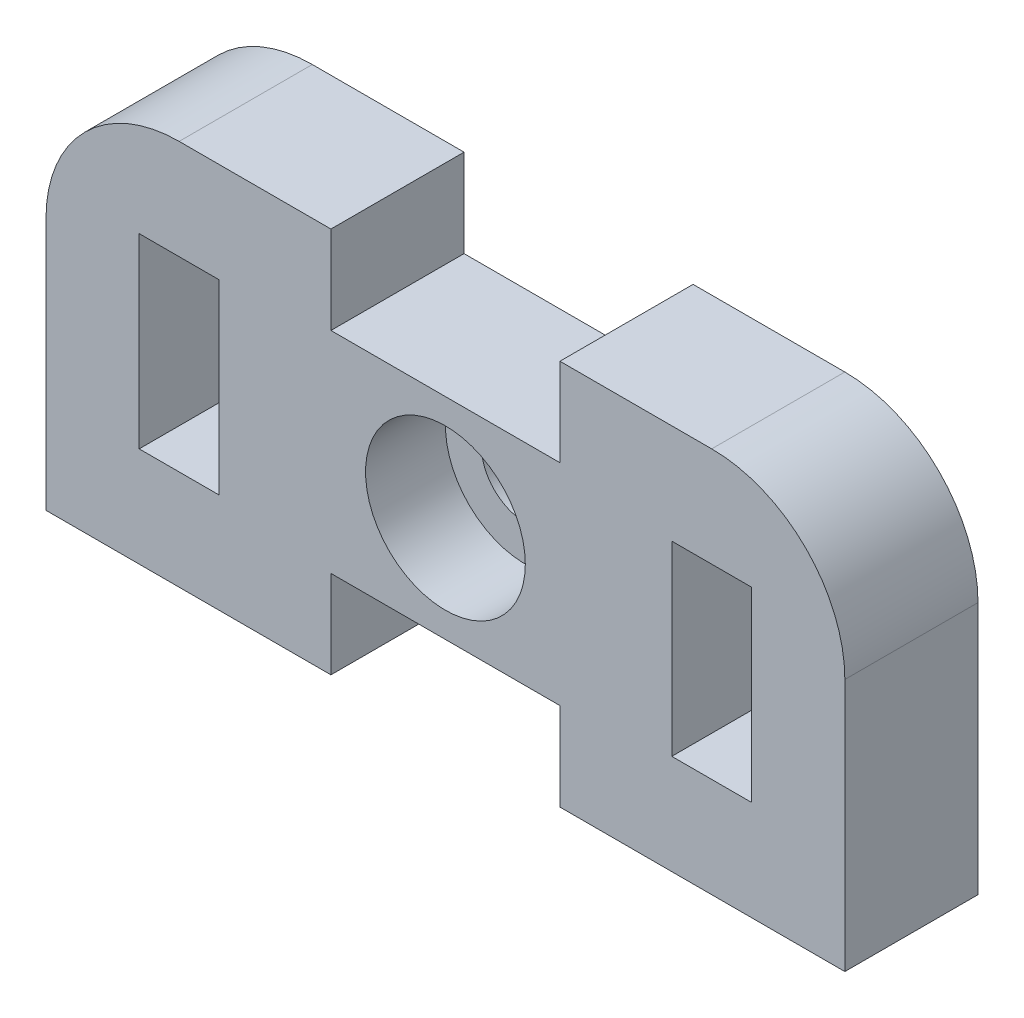
ISO-10303-21;
HEADER;
FILE_DESCRIPTION(('STEP AP214'),'2;1');
FILE_NAME('part.step','',(''),(''),'','','');
FILE_SCHEMA(('AUTOMOTIVE_DESIGN { 1 0 10303 214 1 1 1 1 }'));
ENDSEC;
DATA;
#1=APPLICATION_CONTEXT('core data for automotive mechanical design processes');
#2=APPLICATION_PROTOCOL_DEFINITION('international standard','automotive_design',2000,#1);
#3=PRODUCT_CONTEXT('',#1,'mechanical');
#4=PRODUCT('Part','Part','',(#3));
#5=PRODUCT_RELATED_PRODUCT_CATEGORY('part','',(#4));
#6=PRODUCT_DEFINITION_FORMATION('','',#4);
#7=PRODUCT_DEFINITION_CONTEXT('part definition',#1,'design');
#8=PRODUCT_DEFINITION('design','',#6,#7);
#9=PRODUCT_DEFINITION_SHAPE('','',#8);
#10=(LENGTH_UNIT() NAMED_UNIT(*) SI_UNIT(.MILLI.,.METRE.));
#11=(NAMED_UNIT(*) PLANE_ANGLE_UNIT() SI_UNIT($,.RADIAN.));
#12=(NAMED_UNIT(*) SI_UNIT($,.STERADIAN.) SOLID_ANGLE_UNIT());
#13=UNCERTAINTY_MEASURE_WITH_UNIT(LENGTH_MEASURE(1.E-05),#10,'distance_accuracy_value','');
#14=(GEOMETRIC_REPRESENTATION_CONTEXT(3) GLOBAL_UNCERTAINTY_ASSIGNED_CONTEXT((#13)) GLOBAL_UNIT_ASSIGNED_CONTEXT((#10,
#11,#12)) REPRESENTATION_CONTEXT('',''));
#15=CARTESIAN_POINT('',(0.,0.,0.));
#16=DIRECTION('',(0.,0.,1.));
#17=DIRECTION('',(1.,0.,0.));
#18=AXIS2_PLACEMENT_3D('',#15,#16,#17);
#19=CARTESIAN_POINT('',(-1.43060106815256E-13,57.75,244.));
#20=DIRECTION('',(0.,0.,-1.));
#21=DIRECTION('',(-1.,0.,0.));
#22=AXIS2_PLACEMENT_3D('',#19,#20,#21);
#23=CYLINDRICAL_SURFACE('',#22,1.65);
#24=CARTESIAN_POINT('',(-1.41835460016109E-13,57.75,239.));
#25=DIRECTION('',(0.,0.,1.));
#26=DIRECTION('',(1.,0.,0.));
#27=AXIS2_PLACEMENT_3D('',#24,#25,#26);
#28=CIRCLE('',#27,1.65);
#29=CARTESIAN_POINT('',(1.64999999999986,57.75,239.));
#30=VERTEX_POINT('',#29);
#31=EDGE_CURVE('E306',#30,#30,#28,.T.);
#32=ORIENTED_EDGE('',*,*,#31,.F.);
#33=EDGE_LOOP('',(#32));
#34=FACE_BOUND('',#33,.T.);
#35=CARTESIAN_POINT('',(-1.42325318735768E-13,57.75,241.));
#36=DIRECTION('',(0.,0.,1.));
#37=DIRECTION('',(1.,0.,0.));
#38=AXIS2_PLACEMENT_3D('',#35,#36,#37);
#39=CIRCLE('',#38,1.65);
#40=CARTESIAN_POINT('',(1.64999999999986,57.75,241.));
#41=VERTEX_POINT('',#40);
#42=EDGE_CURVE('E611',#41,#41,#39,.T.);
#43=ORIENTED_EDGE('',*,*,#42,.T.);
#44=EDGE_LOOP('',(#43));
#45=FACE_BOUND('',#44,.T.);
#46=ADVANCED_FACE('F16',(#34,#45),#23,.F.);
#47=CARTESIAN_POINT('',(8.49999999999986,58.0388661026955,244.));
#48=DIRECTION('',(-1.,0.,0.));
#49=DIRECTION('',(0.,0.,1.));
#50=AXIS2_PLACEMENT_3D('',#47,#48,#49);
#51=PLANE('',#50);
#52=DIRECTION('',(0.,1.,0.));
#53=VECTOR('',#52,1.);
#54=CARTESIAN_POINT('',(8.49999999999986,58.0388661026955,239.));
#55=LINE('',#54,#53);
#56=CARTESIAN_POINT('',(8.49999999999986,54.25,239.));
#57=VERTEX_POINT('',#56);
#58=CARTESIAN_POINT('',(8.49999999999986,61.25,239.));
#59=VERTEX_POINT('',#58);
#60=EDGE_CURVE('E361',#57,#59,#55,.T.);
#61=ORIENTED_EDGE('',*,*,#60,.T.);
#62=DIRECTION('',(0.,0.,-1.));
#63=VECTOR('',#62,1.);
#64=CARTESIAN_POINT('',(8.49999999999986,61.25,244.));
#65=LINE('',#64,#63);
#66=CARTESIAN_POINT('',(8.49999999999986,61.25,244.));
#67=VERTEX_POINT('',#66);
#68=EDGE_CURVE('E386',#67,#59,#65,.T.);
#69=ORIENTED_EDGE('',*,*,#68,.F.);
#70=DIRECTION('',(0.,1.,0.));
#71=VECTOR('',#70,1.);
#72=CARTESIAN_POINT('',(8.49999999999986,58.0388661026955,244.));
#73=LINE('',#72,#71);
#74=CARTESIAN_POINT('',(8.49999999999986,54.25,244.));
#75=VERTEX_POINT('',#74);
#76=EDGE_CURVE('E290',#75,#67,#73,.T.);
#77=ORIENTED_EDGE('',*,*,#76,.F.);
#78=DIRECTION('',(0.,0.,-1.));
#79=VECTOR('',#78,1.);
#80=CARTESIAN_POINT('',(8.49999999999986,54.25,244.));
#81=LINE('',#80,#79);
#82=EDGE_CURVE('E376',#75,#57,#81,.T.);
#83=ORIENTED_EDGE('',*,*,#82,.T.);
#84=EDGE_LOOP('',(#61,#69,#77,#83));
#85=FACE_BOUND('',#84,.T.);
#86=ADVANCED_FACE('F553',(#85),#51,.F.);
#87=CARTESIAN_POINT('',(10.4893748685716,61.25,244.));
#88=DIRECTION('',(0.,1.,0.));
#89=DIRECTION('',(0.,0.,1.));
#90=AXIS2_PLACEMENT_3D('',#87,#88,#89);
#91=PLANE('',#90);
#92=DIRECTION('',(1.,0.,0.));
#93=VECTOR('',#92,1.);
#94=CARTESIAN_POINT('',(10.4893748685716,61.25,239.));
#95=LINE('',#94,#93);
#96=CARTESIAN_POINT('',(11.4999999999999,61.25,239.));
#97=VERTEX_POINT('',#96);
#98=EDGE_CURVE('E365',#59,#97,#95,.T.);
#99=ORIENTED_EDGE('',*,*,#98,.T.);
#100=DIRECTION('',(0.,0.,-1.));
#101=VECTOR('',#100,1.);
#102=CARTESIAN_POINT('',(11.4999999999999,61.25,244.));
#103=LINE('',#102,#101);
#104=CARTESIAN_POINT('',(11.4999999999999,61.25,244.));
#105=VERTEX_POINT('',#104);
#106=EDGE_CURVE('E383',#105,#97,#103,.T.);
#107=ORIENTED_EDGE('',*,*,#106,.F.);
#108=DIRECTION('',(1.,0.,0.));
#109=VECTOR('',#108,1.);
#110=CARTESIAN_POINT('',(10.4893748685716,61.25,244.));
#111=LINE('',#110,#109);
#112=EDGE_CURVE('E294',#67,#105,#111,.T.);
#113=ORIENTED_EDGE('',*,*,#112,.F.);
#114=ORIENTED_EDGE('',*,*,#68,.T.);
#115=EDGE_LOOP('',(#99,#107,#113,#114));
#116=FACE_BOUND('',#115,.T.);
#117=ADVANCED_FACE('F548',(#116),#91,.F.);
#118=CARTESIAN_POINT('',(11.4999999999999,58.0388661026955,244.));
#119=DIRECTION('',(-1.,0.,0.));
#120=DIRECTION('',(0.,0.,1.));
#121=AXIS2_PLACEMENT_3D('',#118,#119,#120);
#122=PLANE('',#121);
#123=DIRECTION('',(0.,1.,0.));
#124=VECTOR('',#123,1.);
#125=CARTESIAN_POINT('',(11.4999999999999,58.0388661026955,239.));
#126=LINE('',#125,#124);
#127=CARTESIAN_POINT('',(11.4999999999999,54.25,239.));
#128=VERTEX_POINT('',#127);
#129=EDGE_CURVE('E369',#128,#97,#126,.T.);
#130=ORIENTED_EDGE('',*,*,#129,.F.);
#131=DIRECTION('',(0.,0.,-1.));
#132=VECTOR('',#131,1.);
#133=CARTESIAN_POINT('',(11.4999999999999,54.25,244.));
#134=LINE('',#133,#132);
#135=CARTESIAN_POINT('',(11.4999999999999,54.25,244.));
#136=VERTEX_POINT('',#135);
#137=EDGE_CURVE('E379',#136,#128,#134,.T.);
#138=ORIENTED_EDGE('',*,*,#137,.F.);
#139=DIRECTION('',(0.,1.,0.));
#140=VECTOR('',#139,1.);
#141=CARTESIAN_POINT('',(11.4999999999999,58.0388661026955,244.));
#142=LINE('',#141,#140);
#143=EDGE_CURVE('E297',#136,#105,#142,.T.);
#144=ORIENTED_EDGE('',*,*,#143,.T.);
#145=ORIENTED_EDGE('',*,*,#106,.T.);
#146=EDGE_LOOP('',(#130,#138,#144,#145));
#147=FACE_BOUND('',#146,.T.);
#148=ADVANCED_FACE('F552',(#147),#122,.T.);
#149=CARTESIAN_POINT('',(0.,50.5,244.));
#150=DIRECTION('',(0.,-1.,0.));
#151=DIRECTION('',(0.,0.,-1.));
#152=AXIS2_PLACEMENT_3D('',#149,#150,#151);
#153=PLANE('',#152);
#154=DIRECTION('',(-1.,0.,0.));
#155=VECTOR('',#154,1.);
#156=CARTESIAN_POINT('',(0.,50.5,239.));
#157=LINE('',#156,#155);
#158=CARTESIAN_POINT('',(-4.30000000000014,50.5,239.));
#159=VERTEX_POINT('',#158);
#160=CARTESIAN_POINT('',(-15.,50.5,239.));
#161=VERTEX_POINT('',#160);
#162=EDGE_CURVE('E322',#159,#161,#157,.T.);
#163=ORIENTED_EDGE('',*,*,#162,.F.);
#164=DIRECTION('',(0.,0.,-1.));
#165=VECTOR('',#164,1.);
#166=CARTESIAN_POINT('',(-4.30000000000014,50.5,244.));
#167=LINE('',#166,#165);
#168=CARTESIAN_POINT('',(-4.30000000000014,50.5,244.));
#169=VERTEX_POINT('',#168);
#170=EDGE_CURVE('E380',#169,#159,#167,.T.);
#171=ORIENTED_EDGE('',*,*,#170,.F.);
#172=DIRECTION('',(-1.,0.,0.));
#173=VECTOR('',#172,1.);
#174=CARTESIAN_POINT('',(0.,50.5,244.));
#175=LINE('',#174,#173);
#176=CARTESIAN_POINT('',(-15.,50.5,244.));
#177=VERTEX_POINT('',#176);
#178=EDGE_CURVE('E253',#169,#177,#175,.T.);
#179=ORIENTED_EDGE('',*,*,#178,.T.);
#180=DIRECTION('',(0.,0.,-1.));
#181=VECTOR('',#180,1.);
#182=CARTESIAN_POINT('',(-15.,50.5,244.));
#183=LINE('',#182,#181);
#184=EDGE_CURVE('E226',#177,#161,#183,.T.);
#185=ORIENTED_EDGE('',*,*,#184,.T.);
#186=EDGE_LOOP('',(#163,#171,#179,#185));
#187=FACE_BOUND('',#186,.T.);
#188=ADVANCED_FACE('F463',(#187),#153,.T.);
#189=CARTESIAN_POINT('',(-4.30000000000014,53.0788219124079,244.));
#190=DIRECTION('',(-1.,0.,0.));
#191=DIRECTION('',(0.,0.,1.));
#192=AXIS2_PLACEMENT_3D('',#189,#190,#191);
#193=PLANE('',#192);
#194=DIRECTION('',(0.,1.,0.));
#195=VECTOR('',#194,1.);
#196=CARTESIAN_POINT('',(-4.30000000000014,53.0788219124079,239.));
#197=LINE('',#196,#195);
#198=CARTESIAN_POINT('',(-4.30000000000014,53.8,239.));
#199=VERTEX_POINT('',#198);
#200=EDGE_CURVE('E326',#159,#199,#197,.T.);
#201=ORIENTED_EDGE('',*,*,#200,.T.);
#202=DIRECTION('',(0.,0.,-1.));
#203=VECTOR('',#202,1.);
#204=CARTESIAN_POINT('',(-4.30000000000014,53.8,244.));
#205=LINE('',#204,#203);
#206=CARTESIAN_POINT('',(-4.30000000000014,53.8,244.));
#207=VERTEX_POINT('',#206);
#208=EDGE_CURVE('E418',#207,#199,#205,.T.);
#209=ORIENTED_EDGE('',*,*,#208,.F.);
#210=DIRECTION('',(0.,1.,0.));
#211=VECTOR('',#210,1.);
#212=CARTESIAN_POINT('',(-4.30000000000014,53.0788219124079,244.));
#213=LINE('',#212,#211);
#214=EDGE_CURVE('E257',#169,#207,#213,.T.);
#215=ORIENTED_EDGE('',*,*,#214,.F.);
#216=ORIENTED_EDGE('',*,*,#170,.T.);
#217=EDGE_LOOP('',(#201,#209,#215,#216));
#218=FACE_BOUND('',#217,.T.);
#219=ADVANCED_FACE('F472',(#218),#193,.F.);
#220=CARTESIAN_POINT('',(-0.0293236225844026,53.8,244.));
#221=DIRECTION('',(0.,-1.,0.));
#222=DIRECTION('',(1.,0.,0.));
#223=AXIS2_PLACEMENT_3D('',#220,#221,#222);
#224=PLANE('',#223);
#225=DIRECTION('',(-1.,0.,0.));
#226=VECTOR('',#225,1.);
#227=CARTESIAN_POINT('',(-0.0293236225844014,53.8,239.));
#228=LINE('',#227,#226);
#229=CARTESIAN_POINT('',(4.29999999999986,53.8,239.));
#230=VERTEX_POINT('',#229);
#231=EDGE_CURVE('E331',#230,#199,#228,.T.);
#232=ORIENTED_EDGE('',*,*,#231,.F.);
#233=DIRECTION('',(0.,0.,-1.));
#234=VECTOR('',#233,1.);
#235=CARTESIAN_POINT('',(4.29999999999986,53.8,244.));
#236=LINE('',#235,#234);
#237=CARTESIAN_POINT('',(4.29999999999986,53.8,244.));
#238=VERTEX_POINT('',#237);
#239=EDGE_CURVE('E415',#238,#230,#236,.T.);
#240=ORIENTED_EDGE('',*,*,#239,.F.);
#241=DIRECTION('',(-1.,0.,0.));
#242=VECTOR('',#241,1.);
#243=CARTESIAN_POINT('',(-0.0293236225844026,53.8,244.));
#244=LINE('',#243,#242);
#245=EDGE_CURVE('E261',#238,#207,#244,.T.);
#246=ORIENTED_EDGE('',*,*,#245,.T.);
#247=ORIENTED_EDGE('',*,*,#208,.T.);
#248=EDGE_LOOP('',(#232,#240,#246,#247));
#249=FACE_BOUND('',#248,.T.);
#250=ADVANCED_FACE('F475',(#249),#224,.T.);
#251=CARTESIAN_POINT('',(4.29999999999986,53.0788219124079,244.));
#252=DIRECTION('',(-1.,0.,0.));
#253=DIRECTION('',(0.,0.,1.));
#254=AXIS2_PLACEMENT_3D('',#251,#252,#253);
#255=PLANE('',#254);
#256=DIRECTION('',(0.,1.,0.));
#257=VECTOR('',#256,1.);
#258=CARTESIAN_POINT('',(4.29999999999986,53.0788219124079,239.));
#259=LINE('',#258,#257);
#260=CARTESIAN_POINT('',(4.29999999999986,50.5,239.));
#261=VERTEX_POINT('',#260);
#262=EDGE_CURVE('E335',#261,#230,#259,.T.);
#263=ORIENTED_EDGE('',*,*,#262,.F.);
#264=DIRECTION('',(0.,0.,-1.));
#265=VECTOR('',#264,1.);
#266=CARTESIAN_POINT('',(4.29999999999986,50.5,244.));
#267=LINE('',#266,#265);
#268=CARTESIAN_POINT('',(4.29999999999986,50.5,244.));
#269=VERTEX_POINT('',#268);
#270=EDGE_CURVE('E412',#269,#261,#267,.T.);
#271=ORIENTED_EDGE('',*,*,#270,.F.);
#272=DIRECTION('',(0.,1.,0.));
#273=VECTOR('',#272,1.);
#274=CARTESIAN_POINT('',(4.29999999999986,53.0788219124079,244.));
#275=LINE('',#274,#273);
#276=EDGE_CURVE('E265',#269,#238,#275,.T.);
#277=ORIENTED_EDGE('',*,*,#276,.T.);
#278=ORIENTED_EDGE('',*,*,#239,.T.);
#279=EDGE_LOOP('',(#263,#271,#277,#278));
#280=FACE_BOUND('',#279,.T.);
#281=ADVANCED_FACE('F478',(#280),#255,.T.);
#282=CARTESIAN_POINT('',(15.,50.5,239.));
#283=VERTEX_POINT('',#282);
#284=EDGE_CURVE('E327',#283,#261,#157,.T.);
#285=ORIENTED_EDGE('',*,*,#284,.F.);
#286=DIRECTION('',(0.,0.,-1.));
#287=VECTOR('',#286,1.);
#288=CARTESIAN_POINT('',(15.,50.5,244.));
#289=LINE('',#288,#287);
#290=CARTESIAN_POINT('',(15.,50.5,244.));
#291=VERTEX_POINT('',#290);
#292=EDGE_CURVE('E408',#291,#283,#289,.T.);
#293=ORIENTED_EDGE('',*,*,#292,.F.);
#294=EDGE_CURVE('E258',#291,#269,#175,.T.);
#295=ORIENTED_EDGE('',*,*,#294,.T.);
#296=ORIENTED_EDGE('',*,*,#270,.T.);
#297=EDGE_LOOP('',(#285,#293,#295,#296));
#298=FACE_BOUND('',#297,.T.);
#299=ADVANCED_FACE('F485',(#298),#153,.T.);
#300=CARTESIAN_POINT('',(15.,65.,244.));
#301=DIRECTION('',(1.,0.,0.));
#302=DIRECTION('',(0.,0.,-1.));
#303=AXIS2_PLACEMENT_3D('',#300,#301,#302);
#304=PLANE('',#303);
#305=DIRECTION('',(0.,-1.,0.));
#306=VECTOR('',#305,1.);
#307=CARTESIAN_POINT('',(15.,65.,239.));
#308=LINE('',#307,#306);
#309=CARTESIAN_POINT('',(15.,60.,239.));
#310=VERTEX_POINT('',#309);
#311=EDGE_CURVE('E339',#310,#283,#308,.T.);
#312=ORIENTED_EDGE('',*,*,#311,.F.);
#313=DIRECTION('',(0.,0.,-1.));
#314=VECTOR('',#313,1.);
#315=CARTESIAN_POINT('',(15.,60.,244.));
#316=LINE('',#315,#314);
#317=CARTESIAN_POINT('',(15.,60.,244.));
#318=VERTEX_POINT('',#317);
#319=EDGE_CURVE('E439',#310,#318,#316,.F.);
#320=ORIENTED_EDGE('',*,*,#319,.T.);
#321=DIRECTION('',(0.,-1.,0.));
#322=VECTOR('',#321,1.);
#323=CARTESIAN_POINT('',(15.,65.,244.));
#324=LINE('',#323,#322);
#325=EDGE_CURVE('E269',#318,#291,#324,.T.);
#326=ORIENTED_EDGE('',*,*,#325,.T.);
#327=ORIENTED_EDGE('',*,*,#292,.T.);
#328=EDGE_LOOP('',(#312,#320,#326,#327));
#329=FACE_BOUND('',#328,.T.);
#330=ADVANCED_FACE('F595',(#329),#304,.T.);
#331=CARTESIAN_POINT('',(0.,65.,244.));
#332=DIRECTION('',(0.,-1.,0.));
#333=DIRECTION('',(0.,0.,-1.));
#334=AXIS2_PLACEMENT_3D('',#331,#332,#333);
#335=PLANE('',#334);
#336=DIRECTION('',(-1.,0.,0.));
#337=VECTOR('',#336,1.);
#338=CARTESIAN_POINT('',(0.,65.,244.));
#339=LINE('',#338,#337);
#340=CARTESIAN_POINT('',(10.,65.,244.));
#341=VERTEX_POINT('',#340);
#342=CARTESIAN_POINT('',(4.29999999999986,65.,244.));
#343=VERTEX_POINT('',#342);
#344=EDGE_CURVE('E272',#341,#343,#339,.T.);
#345=ORIENTED_EDGE('',*,*,#344,.F.);
#346=DIRECTION('',(0.,0.,-1.));
#347=VECTOR('',#346,1.);
#348=CARTESIAN_POINT('',(10.,65.,239.));
#349=LINE('',#348,#347);
#350=CARTESIAN_POINT('',(10.,65.,239.));
#351=VERTEX_POINT('',#350);
#352=EDGE_CURVE('E390',#341,#351,#349,.T.);
#353=ORIENTED_EDGE('',*,*,#352,.T.);
#354=DIRECTION('',(-1.,0.,0.));
#355=VECTOR('',#354,1.);
#356=CARTESIAN_POINT('',(0.,65.,239.));
#357=LINE('',#356,#355);
#358=CARTESIAN_POINT('',(4.29999999999986,65.,239.));
#359=VERTEX_POINT('',#358);
#360=EDGE_CURVE('E342',#351,#359,#357,.T.);
#361=ORIENTED_EDGE('',*,*,#360,.T.);
#362=DIRECTION('',(0.,0.,-1.));
#363=VECTOR('',#362,1.);
#364=CARTESIAN_POINT('',(4.29999999999986,65.,244.));
#365=LINE('',#364,#363);
#366=EDGE_CURVE('E404',#343,#359,#365,.T.);
#367=ORIENTED_EDGE('',*,*,#366,.F.);
#368=EDGE_LOOP('',(#345,#353,#361,#367));
#369=FACE_BOUND('',#368,.T.);
#370=ADVANCED_FACE('F509',(#369),#335,.F.);
#371=CARTESIAN_POINT('',(4.29999999999986,63.046423715353,244.));
#372=DIRECTION('',(1.,0.,0.));
#373=DIRECTION('',(0.,1.,0.));
#374=AXIS2_PLACEMENT_3D('',#371,#372,#373);
#375=PLANE('',#374);
#376=DIRECTION('',(0.,-1.,0.));
#377=VECTOR('',#376,1.);
#378=CARTESIAN_POINT('',(4.29999999999986,63.046423715353,239.));
#379=LINE('',#378,#377);
#380=CARTESIAN_POINT('',(4.29999999999986,61.7,239.));
#381=VERTEX_POINT('',#380);
#382=EDGE_CURVE('E345',#359,#381,#379,.T.);
#383=ORIENTED_EDGE('',*,*,#382,.T.);
#384=DIRECTION('',(0.,0.,-1.));
#385=VECTOR('',#384,1.);
#386=CARTESIAN_POINT('',(4.29999999999986,61.7,244.));
#387=LINE('',#386,#385);
#388=CARTESIAN_POINT('',(4.29999999999986,61.7,244.));
#389=VERTEX_POINT('',#388);
#390=EDGE_CURVE('E400',#389,#381,#387,.T.);
#391=ORIENTED_EDGE('',*,*,#390,.F.);
#392=DIRECTION('',(0.,-1.,0.));
#393=VECTOR('',#392,1.);
#394=CARTESIAN_POINT('',(4.29999999999986,63.046423715353,244.));
#395=LINE('',#394,#393);
#396=EDGE_CURVE('E275',#343,#389,#395,.T.);
#397=ORIENTED_EDGE('',*,*,#396,.F.);
#398=ORIENTED_EDGE('',*,*,#366,.T.);
#399=EDGE_LOOP('',(#383,#391,#397,#398));
#400=FACE_BOUND('',#399,.T.);
#401=ADVANCED_FACE('F500',(#400),#375,.F.);
#402=CARTESIAN_POINT('',(-0.00538397580391191,61.7,244.));
#403=DIRECTION('',(0.,-1.,0.));
#404=DIRECTION('',(1.,0.,0.));
#405=AXIS2_PLACEMENT_3D('',#402,#403,#404);
#406=PLANE('',#405);
#407=DIRECTION('',(-1.,0.,0.));
#408=VECTOR('',#407,1.);
#409=CARTESIAN_POINT('',(-0.00538397580391069,61.7,239.));
#410=LINE('',#409,#408);
#411=CARTESIAN_POINT('',(-4.30000000000014,61.7,239.));
#412=VERTEX_POINT('',#411);
#413=EDGE_CURVE('E350',#381,#412,#410,.T.);
#414=ORIENTED_EDGE('',*,*,#413,.T.);
#415=DIRECTION('',(0.,0.,-1.));
#416=VECTOR('',#415,1.);
#417=CARTESIAN_POINT('',(-4.30000000000014,61.7,244.));
#418=LINE('',#417,#416);
#419=CARTESIAN_POINT('',(-4.30000000000014,61.7,244.));
#420=VERTEX_POINT('',#419);
#421=EDGE_CURVE('E397',#420,#412,#418,.T.);
#422=ORIENTED_EDGE('',*,*,#421,.F.);
#423=DIRECTION('',(-1.,0.,0.));
#424=VECTOR('',#423,1.);
#425=CARTESIAN_POINT('',(-0.00538397580391191,61.7,244.));
#426=LINE('',#425,#424);
#427=EDGE_CURVE('E280',#389,#420,#426,.T.);
#428=ORIENTED_EDGE('',*,*,#427,.F.);
#429=ORIENTED_EDGE('',*,*,#390,.T.);
#430=EDGE_LOOP('',(#414,#422,#428,#429));
#431=FACE_BOUND('',#430,.T.);
#432=ADVANCED_FACE('F495',(#431),#406,.F.);
#433=CARTESIAN_POINT('',(-4.30000000000014,63.0464237153531,244.));
#434=DIRECTION('',(1.,0.,0.));
#435=DIRECTION('',(0.,1.,0.));
#436=AXIS2_PLACEMENT_3D('',#433,#434,#435);
#437=PLANE('',#436);
#438=DIRECTION('',(0.,-1.,0.));
#439=VECTOR('',#438,1.);
#440=CARTESIAN_POINT('',(-4.30000000000014,63.0464237153531,239.));
#441=LINE('',#440,#439);
#442=CARTESIAN_POINT('',(-4.30000000000014,65.,239.));
#443=VERTEX_POINT('',#442);
#444=EDGE_CURVE('E354',#443,#412,#441,.T.);
#445=ORIENTED_EDGE('',*,*,#444,.F.);
#446=DIRECTION('',(0.,0.,-1.));
#447=VECTOR('',#446,1.);
#448=CARTESIAN_POINT('',(-4.30000000000014,65.,244.));
#449=LINE('',#448,#447);
#450=CARTESIAN_POINT('',(-4.30000000000014,65.,244.));
#451=VERTEX_POINT('',#450);
#452=EDGE_CURVE('E394',#451,#443,#449,.T.);
#453=ORIENTED_EDGE('',*,*,#452,.F.);
#454=DIRECTION('',(0.,-1.,0.));
#455=VECTOR('',#454,1.);
#456=CARTESIAN_POINT('',(-4.30000000000014,63.0464237153531,244.));
#457=LINE('',#456,#455);
#458=EDGE_CURVE('E283',#451,#420,#457,.T.);
#459=ORIENTED_EDGE('',*,*,#458,.T.);
#460=ORIENTED_EDGE('',*,*,#421,.T.);
#461=EDGE_LOOP('',(#445,#453,#459,#460));
#462=FACE_BOUND('',#461,.T.);
#463=ADVANCED_FACE('F499',(#462),#437,.T.);
#464=CARTESIAN_POINT('',(-10.,65.,239.));
#465=VERTEX_POINT('',#464);
#466=EDGE_CURVE('E346',#443,#465,#357,.T.);
#467=ORIENTED_EDGE('',*,*,#466,.T.);
#468=DIRECTION('',(0.,0.,-1.));
#469=VECTOR('',#468,1.);
#470=CARTESIAN_POINT('',(-10.,65.,244.));
#471=LINE('',#470,#469);
#472=CARTESIAN_POINT('',(-10.,65.,244.));
#473=VERTEX_POINT('',#472);
#474=EDGE_CURVE('E10',#465,#473,#471,.F.);
#475=ORIENTED_EDGE('',*,*,#474,.T.);
#476=EDGE_CURVE('E276',#451,#473,#339,.T.);
#477=ORIENTED_EDGE('',*,*,#476,.F.);
#478=ORIENTED_EDGE('',*,*,#452,.T.);
#479=EDGE_LOOP('',(#467,#475,#477,#478));
#480=FACE_BOUND('',#479,.T.);
#481=ADVANCED_FACE('F516',(#480),#335,.F.);
#482=CARTESIAN_POINT('',(-9.4555811733009,61.25,244.));
#483=DIRECTION('',(0.,-1.,0.));
#484=DIRECTION('',(1.,0.,0.));
#485=AXIS2_PLACEMENT_3D('',#482,#483,#484);
#486=PLANE('',#485);
#487=DIRECTION('',(-1.,0.,0.));
#488=VECTOR('',#487,1.);
#489=CARTESIAN_POINT('',(-9.4555811733009,61.25,239.));
#490=LINE('',#489,#488);
#491=CARTESIAN_POINT('',(-8.50000000000014,61.25,239.));
#492=VERTEX_POINT('',#491);
#493=CARTESIAN_POINT('',(-11.5000000000001,61.25,239.));
#494=VERTEX_POINT('',#493);
#495=EDGE_CURVE('E220',#492,#494,#490,.T.);
#496=ORIENTED_EDGE('',*,*,#495,.F.);
#497=DIRECTION('',(0.,0.,-1.));
#498=VECTOR('',#497,1.);
#499=CARTESIAN_POINT('',(-8.50000000000014,61.25,244.));
#500=LINE('',#499,#498);
#501=CARTESIAN_POINT('',(-8.50000000000014,61.25,244.));
#502=VERTEX_POINT('',#501);
#503=EDGE_CURVE('E215',#502,#492,#500,.T.);
#504=ORIENTED_EDGE('',*,*,#503,.F.);
#505=DIRECTION('',(-1.,0.,0.));
#506=VECTOR('',#505,1.);
#507=CARTESIAN_POINT('',(-9.4555811733009,61.25,244.));
#508=LINE('',#507,#506);
#509=CARTESIAN_POINT('',(-11.5000000000001,61.25,244.));
#510=VERTEX_POINT('',#509);
#511=EDGE_CURVE('E218',#502,#510,#508,.T.);
#512=ORIENTED_EDGE('',*,*,#511,.T.);
#513=DIRECTION('',(0.,0.,-1.));
#514=VECTOR('',#513,1.);
#515=CARTESIAN_POINT('',(-11.5000000000001,61.25,244.));
#516=LINE('',#515,#514);
#517=EDGE_CURVE('E305',#510,#494,#516,.T.);
#518=ORIENTED_EDGE('',*,*,#517,.T.);
#519=EDGE_LOOP('',(#496,#504,#512,#518));
#520=FACE_BOUND('',#519,.T.);
#521=ADVANCED_FACE('F217',(#520),#486,.T.);
#522=CARTESIAN_POINT('',(-8.50000000000014,57.9556095898152,244.));
#523=DIRECTION('',(-1.,0.,0.));
#524=DIRECTION('',(0.,0.,1.));
#525=AXIS2_PLACEMENT_3D('',#522,#523,#524);
#526=PLANE('',#525);
#527=DIRECTION('',(0.,1.,0.));
#528=VECTOR('',#527,1.);
#529=CARTESIAN_POINT('',(-8.50000000000014,57.9556095898152,239.));
#530=LINE('',#529,#528);
#531=CARTESIAN_POINT('',(-8.50000000000014,54.25,239.));
#532=VERTEX_POINT('',#531);
#533=EDGE_CURVE('E313',#532,#492,#530,.T.);
#534=ORIENTED_EDGE('',*,*,#533,.F.);
#535=DIRECTION('',(0.,0.,-1.));
#536=VECTOR('',#535,1.);
#537=CARTESIAN_POINT('',(-8.50000000000014,54.25,244.));
#538=LINE('',#537,#536);
#539=CARTESIAN_POINT('',(-8.50000000000014,54.25,244.));
#540=VERTEX_POINT('',#539);
#541=EDGE_CURVE('E227',#540,#532,#538,.T.);
#542=ORIENTED_EDGE('',*,*,#541,.F.);
#543=DIRECTION('',(0.,1.,0.));
#544=VECTOR('',#543,1.);
#545=CARTESIAN_POINT('',(-8.50000000000014,57.9556095898152,244.));
#546=LINE('',#545,#544);
#547=EDGE_CURVE('E233',#540,#502,#546,.T.);
#548=ORIENTED_EDGE('',*,*,#547,.T.);
#549=ORIENTED_EDGE('',*,*,#503,.T.);
#550=EDGE_LOOP('',(#534,#542,#548,#549));
#551=FACE_BOUND('',#550,.T.);
#552=ADVANCED_FACE('F239',(#551),#526,.T.);
#553=CARTESIAN_POINT('',(-9.45558117330088,54.25,244.));
#554=DIRECTION('',(0.,-1.,0.));
#555=DIRECTION('',(1.,0.,0.));
#556=AXIS2_PLACEMENT_3D('',#553,#554,#555);
#557=PLANE('',#556);
#558=DIRECTION('',(-1.,0.,0.));
#559=VECTOR('',#558,1.);
#560=CARTESIAN_POINT('',(-9.45558117330088,54.25,239.));
#561=LINE('',#560,#559);
#562=CARTESIAN_POINT('',(-11.5000000000001,54.25,239.));
#563=VERTEX_POINT('',#562);
#564=EDGE_CURVE('E315',#532,#563,#561,.T.);
#565=ORIENTED_EDGE('',*,*,#564,.T.);
#566=DIRECTION('',(0.,0.,-1.));
#567=VECTOR('',#566,1.);
#568=CARTESIAN_POINT('',(-11.5000000000001,54.25,244.));
#569=LINE('',#568,#567);
#570=CARTESIAN_POINT('',(-11.5000000000001,54.25,244.));
#571=VERTEX_POINT('',#570);
#572=EDGE_CURVE('E425',#571,#563,#569,.T.);
#573=ORIENTED_EDGE('',*,*,#572,.F.);
#574=DIRECTION('',(-1.,0.,0.));
#575=VECTOR('',#574,1.);
#576=CARTESIAN_POINT('',(-9.45558117330088,54.25,244.));
#577=LINE('',#576,#575);
#578=EDGE_CURVE('E242',#540,#571,#577,.T.);
#579=ORIENTED_EDGE('',*,*,#578,.F.);
#580=ORIENTED_EDGE('',*,*,#541,.T.);
#581=EDGE_LOOP('',(#565,#573,#579,#580));
#582=FACE_BOUND('',#581,.T.);
#583=ADVANCED_FACE('F570',(#582),#557,.F.);
#584=CARTESIAN_POINT('',(-15.,65.,244.));
#585=DIRECTION('',(1.,0.,0.));
#586=DIRECTION('',(0.,0.,-1.));
#587=AXIS2_PLACEMENT_3D('',#584,#585,#586);
#588=PLANE('',#587);
#589=DIRECTION('',(0.,-1.,0.));
#590=VECTOR('',#589,1.);
#591=CARTESIAN_POINT('',(-15.,65.,244.));
#592=LINE('',#591,#590);
#593=CARTESIAN_POINT('',(-15.,60.,244.));
#594=VERTEX_POINT('',#593);
#595=EDGE_CURVE('E287',#594,#177,#592,.T.);
#596=ORIENTED_EDGE('',*,*,#595,.F.);
#597=DIRECTION('',(0.,0.,-1.));
#598=VECTOR('',#597,1.);
#599=CARTESIAN_POINT('',(-15.,60.,244.));
#600=LINE('',#599,#598);
#601=CARTESIAN_POINT('',(-15.,60.,239.));
#602=VERTEX_POINT('',#601);
#603=EDGE_CURVE('E25',#594,#602,#600,.T.);
#604=ORIENTED_EDGE('',*,*,#603,.T.);
#605=DIRECTION('',(0.,-1.,0.));
#606=VECTOR('',#605,1.);
#607=CARTESIAN_POINT('',(-15.,65.,239.));
#608=LINE('',#607,#606);
#609=EDGE_CURVE('E358',#602,#161,#608,.T.);
#610=ORIENTED_EDGE('',*,*,#609,.T.);
#611=ORIENTED_EDGE('',*,*,#184,.F.);
#612=EDGE_LOOP('',(#596,#604,#610,#611));
#613=FACE_BOUND('',#612,.T.);
#614=ADVANCED_FACE('F452',(#613),#588,.F.);
#615=CARTESIAN_POINT('',(-11.5000000000001,57.9556095898152,244.));
#616=DIRECTION('',(-1.,0.,0.));
#617=DIRECTION('',(0.,0.,1.));
#618=AXIS2_PLACEMENT_3D('',#615,#616,#617);
#619=PLANE('',#618);
#620=DIRECTION('',(0.,1.,0.));
#621=VECTOR('',#620,1.);
#622=CARTESIAN_POINT('',(-11.5000000000001,57.9556095898152,239.));
#623=LINE('',#622,#621);
#624=EDGE_CURVE('E319',#563,#494,#623,.T.);
#625=ORIENTED_EDGE('',*,*,#624,.T.);
#626=ORIENTED_EDGE('',*,*,#517,.F.);
#627=DIRECTION('',(0.,1.,0.));
#628=VECTOR('',#627,1.);
#629=CARTESIAN_POINT('',(-11.5000000000001,57.9556095898152,244.));
#630=LINE('',#629,#628);
#631=EDGE_CURVE('E234',#571,#510,#630,.T.);
#632=ORIENTED_EDGE('',*,*,#631,.F.);
#633=ORIENTED_EDGE('',*,*,#572,.T.);
#634=EDGE_LOOP('',(#625,#626,#632,#633));
#635=FACE_BOUND('',#634,.T.);
#636=ADVANCED_FACE('F542',(#635),#619,.F.);
#637=CARTESIAN_POINT('',(10.4893748685716,54.25,244.));
#638=DIRECTION('',(0.,1.,0.));
#639=DIRECTION('',(0.,0.,1.));
#640=AXIS2_PLACEMENT_3D('',#637,#638,#639);
#641=PLANE('',#640);
#642=DIRECTION('',(1.,0.,0.));
#643=VECTOR('',#642,1.);
#644=CARTESIAN_POINT('',(10.4893748685716,54.25,239.));
#645=LINE('',#644,#643);
#646=EDGE_CURVE('E237',#57,#128,#645,.T.);
#647=ORIENTED_EDGE('',*,*,#646,.F.);
#648=ORIENTED_EDGE('',*,*,#82,.F.);
#649=DIRECTION('',(1.,0.,0.));
#650=VECTOR('',#649,1.);
#651=CARTESIAN_POINT('',(10.4893748685716,54.25,244.));
#652=LINE('',#651,#650);
#653=EDGE_CURVE('E301',#75,#136,#652,.T.);
#654=ORIENTED_EDGE('',*,*,#653,.T.);
#655=ORIENTED_EDGE('',*,*,#137,.T.);
#656=EDGE_LOOP('',(#647,#648,#654,#655));
#657=FACE_BOUND('',#656,.T.);
#658=ADVANCED_FACE('F538',(#657),#641,.T.);
#659=CARTESIAN_POINT('',(0.,57.75,244.));
#660=DIRECTION('',(0.,0.,1.));
#661=DIRECTION('',(1.,0.,0.));
#662=AXIS2_PLACEMENT_3D('',#659,#660,#661);
#663=PLANE('',#662);
#664=CARTESIAN_POINT('',(-1.43060106815256E-13,57.75,244.));
#665=DIRECTION('',(0.,0.,1.));
#666=DIRECTION('',(1.,0.,0.));
#667=AXIS2_PLACEMENT_3D('',#664,#665,#666);
#668=CIRCLE('',#667,3.);
#669=CARTESIAN_POINT('',(2.99999999999986,57.75,244.));
#670=VERTEX_POINT('',#669);
#671=EDGE_CURVE('E607',#670,#670,#668,.T.);
#672=ORIENTED_EDGE('',*,*,#671,.F.);
#673=EDGE_LOOP('',(#672));
#674=FACE_BOUND('',#673,.T.);
#675=ORIENTED_EDGE('',*,*,#511,.F.);
#676=ORIENTED_EDGE('',*,*,#547,.F.);
#677=ORIENTED_EDGE('',*,*,#578,.T.);
#678=ORIENTED_EDGE('',*,*,#631,.T.);
#679=EDGE_LOOP('',(#675,#676,#677,#678));
#680=FACE_BOUND('',#679,.T.);
#681=ORIENTED_EDGE('',*,*,#325,.F.);
#682=CARTESIAN_POINT('',(10.,60.,244.));
#683=DIRECTION('',(0.,0.,1.));
#684=DIRECTION('',(1.,0.,0.));
#685=AXIS2_PLACEMENT_3D('',#682,#683,#684);
#686=CIRCLE('',#685,5.);
#687=EDGE_CURVE('E444',#318,#341,#686,.T.);
#688=ORIENTED_EDGE('',*,*,#687,.T.);
#689=ORIENTED_EDGE('',*,*,#344,.T.);
#690=ORIENTED_EDGE('',*,*,#396,.T.);
#691=ORIENTED_EDGE('',*,*,#427,.T.);
#692=ORIENTED_EDGE('',*,*,#458,.F.);
#693=ORIENTED_EDGE('',*,*,#476,.T.);
#694=CARTESIAN_POINT('',(-10.,60.,244.));
#695=DIRECTION('',(0.,0.,1.));
#696=DIRECTION('',(1.,0.,0.));
#697=AXIS2_PLACEMENT_3D('',#694,#695,#696);
#698=CIRCLE('',#697,5.);
#699=EDGE_CURVE('E37',#473,#594,#698,.T.);
#700=ORIENTED_EDGE('',*,*,#699,.T.);
#701=ORIENTED_EDGE('',*,*,#595,.T.);
#702=ORIENTED_EDGE('',*,*,#178,.F.);
#703=ORIENTED_EDGE('',*,*,#214,.T.);
#704=ORIENTED_EDGE('',*,*,#245,.F.);
#705=ORIENTED_EDGE('',*,*,#276,.F.);
#706=ORIENTED_EDGE('',*,*,#294,.F.);
#707=EDGE_LOOP('',(#681,#688,#689,#690,#691,#692,#693,#700,#701,#702,#703,#704,#705,#706));
#708=FACE_BOUND('',#707,.T.);
#709=ORIENTED_EDGE('',*,*,#76,.T.);
#710=ORIENTED_EDGE('',*,*,#112,.T.);
#711=ORIENTED_EDGE('',*,*,#143,.F.);
#712=ORIENTED_EDGE('',*,*,#653,.F.);
#713=EDGE_LOOP('',(#709,#710,#711,#712));
#714=FACE_BOUND('',#713,.T.);
#715=ADVANCED_FACE('F231',(#674,#680,#708,#714),#663,.T.);
#716=CARTESIAN_POINT('',(0.,57.75,239.));
#717=DIRECTION('',(0.,0.,1.));
#718=DIRECTION('',(1.,0.,0.));
#719=AXIS2_PLACEMENT_3D('',#716,#717,#718);
#720=PLANE('',#719);
#721=ORIENTED_EDGE('',*,*,#31,.T.);
#722=EDGE_LOOP('',(#721));
#723=FACE_BOUND('',#722,.T.);
#724=ORIENTED_EDGE('',*,*,#495,.T.);
#725=ORIENTED_EDGE('',*,*,#624,.F.);
#726=ORIENTED_EDGE('',*,*,#564,.F.);
#727=ORIENTED_EDGE('',*,*,#533,.T.);
#728=EDGE_LOOP('',(#724,#725,#726,#727));
#729=FACE_BOUND('',#728,.T.);
#730=ORIENTED_EDGE('',*,*,#360,.F.);
#731=CARTESIAN_POINT('',(10.,60.,239.));
#732=DIRECTION('',(0.,0.,1.));
#733=DIRECTION('',(1.,0.,0.));
#734=AXIS2_PLACEMENT_3D('',#731,#732,#733);
#735=CIRCLE('',#734,5.);
#736=EDGE_CURVE('E437',#351,#310,#735,.F.);
#737=ORIENTED_EDGE('',*,*,#736,.T.);
#738=ORIENTED_EDGE('',*,*,#311,.T.);
#739=ORIENTED_EDGE('',*,*,#284,.T.);
#740=ORIENTED_EDGE('',*,*,#262,.T.);
#741=ORIENTED_EDGE('',*,*,#231,.T.);
#742=ORIENTED_EDGE('',*,*,#200,.F.);
#743=ORIENTED_EDGE('',*,*,#162,.T.);
#744=ORIENTED_EDGE('',*,*,#609,.F.);
#745=CARTESIAN_POINT('',(-10.,60.,239.));
#746=DIRECTION('',(0.,0.,1.));
#747=DIRECTION('',(1.,0.,0.));
#748=AXIS2_PLACEMENT_3D('',#745,#746,#747);
#749=CIRCLE('',#748,5.);
#750=EDGE_CURVE('E434',#602,#465,#749,.F.);
#751=ORIENTED_EDGE('',*,*,#750,.T.);
#752=ORIENTED_EDGE('',*,*,#466,.F.);
#753=ORIENTED_EDGE('',*,*,#444,.T.);
#754=ORIENTED_EDGE('',*,*,#413,.F.);
#755=ORIENTED_EDGE('',*,*,#382,.F.);
#756=EDGE_LOOP('',(#730,#737,#738,#739,#740,#741,#742,#743,#744,#751,#752,#753,#754,#755));
#757=FACE_BOUND('',#756,.T.);
#758=ORIENTED_EDGE('',*,*,#60,.F.);
#759=ORIENTED_EDGE('',*,*,#646,.T.);
#760=ORIENTED_EDGE('',*,*,#129,.T.);
#761=ORIENTED_EDGE('',*,*,#98,.F.);
#762=EDGE_LOOP('',(#758,#759,#760,#761));
#763=FACE_BOUND('',#762,.T.);
#764=ADVANCED_FACE('F457',(#723,#729,#757,#763),#720,.F.);
#765=CARTESIAN_POINT('',(-1.42325318735768E-13,57.75,241.));
#766=DIRECTION('',(0.,0.,1.));
#767=DIRECTION('',(1.,0.,0.));
#768=AXIS2_PLACEMENT_3D('',#765,#766,#767);
#769=CYLINDRICAL_SURFACE('',#768,3.);
#770=CARTESIAN_POINT('',(-1.42325318735768E-13,57.75,241.));
#771=DIRECTION('',(0.,0.,1.));
#772=DIRECTION('',(1.,0.,0.));
#773=AXIS2_PLACEMENT_3D('',#770,#771,#772);
#774=CIRCLE('',#773,3.);
#775=CARTESIAN_POINT('',(2.99999999999986,57.75,241.));
#776=VERTEX_POINT('',#775);
#777=EDGE_CURVE('E310',#776,#776,#774,.T.);
#778=ORIENTED_EDGE('',*,*,#777,.F.);
#779=EDGE_LOOP('',(#778));
#780=FACE_BOUND('',#779,.T.);
#781=ORIENTED_EDGE('',*,*,#671,.T.);
#782=EDGE_LOOP('',(#781));
#783=FACE_BOUND('',#782,.T.);
#784=ADVANCED_FACE('F620',(#780,#783),#769,.F.);
#785=CARTESIAN_POINT('',(0.,57.75,241.));
#786=DIRECTION('',(0.,0.,1.));
#787=DIRECTION('',(1.,0.,0.));
#788=AXIS2_PLACEMENT_3D('',#785,#786,#787);
#789=PLANE('',#788);
#790=ORIENTED_EDGE('',*,*,#42,.F.);
#791=EDGE_LOOP('',(#790));
#792=FACE_BOUND('',#791,.T.);
#793=ORIENTED_EDGE('',*,*,#777,.T.);
#794=EDGE_LOOP('',(#793));
#795=FACE_BOUND('',#794,.T.);
#796=ADVANCED_FACE('F624',(#792,#795),#789,.T.);
#797=CARTESIAN_POINT('',(10.,60.,244.));
#798=DIRECTION('',(0.,0.,1.));
#799=DIRECTION('',(1.,0.,0.));
#800=AXIS2_PLACEMENT_3D('',#797,#798,#799);
#801=CYLINDRICAL_SURFACE('',#800,5.);
#802=ORIENTED_EDGE('',*,*,#687,.F.);
#803=ORIENTED_EDGE('',*,*,#319,.F.);
#804=ORIENTED_EDGE('',*,*,#736,.F.);
#805=ORIENTED_EDGE('',*,*,#352,.F.);
#806=EDGE_LOOP('',(#802,#803,#804,#805));
#807=FACE_BOUND('',#806,.T.);
#808=ADVANCED_FACE('F632',(#807),#801,.T.);
#809=CARTESIAN_POINT('',(-10.,60.,244.));
#810=DIRECTION('',(0.,0.,-1.));
#811=DIRECTION('',(-1.,0.,0.));
#812=AXIS2_PLACEMENT_3D('',#809,#810,#811);
#813=CYLINDRICAL_SURFACE('',#812,5.);
#814=ORIENTED_EDGE('',*,*,#699,.F.);
#815=ORIENTED_EDGE('',*,*,#474,.F.);
#816=ORIENTED_EDGE('',*,*,#750,.F.);
#817=ORIENTED_EDGE('',*,*,#603,.F.);
#818=EDGE_LOOP('',(#814,#815,#816,#817));
#819=FACE_BOUND('',#818,.T.);
#820=ADVANCED_FACE('F18',(#819),#813,.T.);
#821=CLOSED_SHELL('',(#46,#86,#117,#148,#188,#219,#250,#281,#299,#330,#370,#401,#432,#463,#481,
#521,#552,#583,#614,#636,#658,#715,#764,#784,#796,#808,#820));
#822=MANIFOLD_SOLID_BREP('B1',#821);
#823=ADVANCED_BREP_SHAPE_REPRESENTATION('',(#18,#822),#14);
#824=SHAPE_DEFINITION_REPRESENTATION(#9,#823);
ENDSEC;
END-ISO-10303-21;
